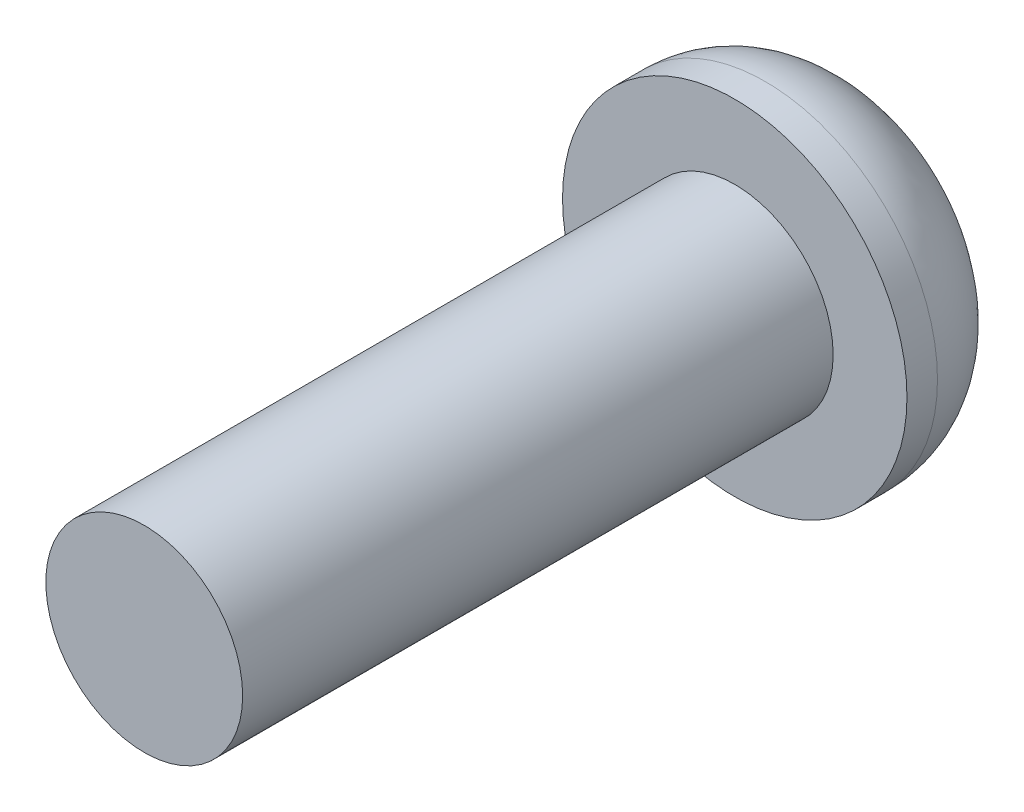
ISO-10303-21;
HEADER;
FILE_DESCRIPTION(('STEP AP214'),'2;1');
FILE_NAME('part.step','',(''),(''),'','','');
FILE_SCHEMA(('AUTOMOTIVE_DESIGN { 1 0 10303 214 1 1 1 1 }'));
ENDSEC;
DATA;
#1=APPLICATION_CONTEXT('core data for automotive mechanical design processes');
#2=APPLICATION_PROTOCOL_DEFINITION('international standard','automotive_design',2000,#1);
#3=PRODUCT_CONTEXT('',#1,'mechanical');
#4=PRODUCT('Part','Part','',(#3));
#5=PRODUCT_RELATED_PRODUCT_CATEGORY('part','',(#4));
#6=PRODUCT_DEFINITION_FORMATION('','',#4);
#7=PRODUCT_DEFINITION_CONTEXT('part definition',#1,'design');
#8=PRODUCT_DEFINITION('design','',#6,#7);
#9=PRODUCT_DEFINITION_SHAPE('','',#8);
#10=(LENGTH_UNIT() NAMED_UNIT(*) SI_UNIT(.MILLI.,.METRE.));
#11=(NAMED_UNIT(*) PLANE_ANGLE_UNIT() SI_UNIT($,.RADIAN.));
#12=(NAMED_UNIT(*) SI_UNIT($,.STERADIAN.) SOLID_ANGLE_UNIT());
#13=UNCERTAINTY_MEASURE_WITH_UNIT(LENGTH_MEASURE(1.E-05),#10,'distance_accuracy_value','');
#14=(GEOMETRIC_REPRESENTATION_CONTEXT(3) GLOBAL_UNCERTAINTY_ASSIGNED_CONTEXT((#13)) GLOBAL_UNIT_ASSIGNED_CONTEXT((#10,
#11,#12)) REPRESENTATION_CONTEXT('',''));
#15=CARTESIAN_POINT('',(0.,0.,0.));
#16=DIRECTION('',(0.,0.,1.));
#17=DIRECTION('',(1.,0.,0.));
#18=AXIS2_PLACEMENT_3D('',#15,#16,#17);
#19=CARTESIAN_POINT('',(0.,0.,6.));
#20=DIRECTION('',(0.,0.,-1.));
#21=DIRECTION('',(-1.,0.,0.));
#22=AXIS2_PLACEMENT_3D('',#19,#20,#21);
#23=CYLINDRICAL_SURFACE('',#22,1.);
#24=CARTESIAN_POINT('',(0.,0.,6.));
#25=DIRECTION('',(0.,0.,1.));
#26=DIRECTION('',(1.,0.,0.));
#27=AXIS2_PLACEMENT_3D('',#24,#25,#26);
#28=CIRCLE('',#27,1.);
#29=CARTESIAN_POINT('',(1.,0.,6.));
#30=VERTEX_POINT('',#29);
#31=EDGE_CURVE('E50',#30,#30,#28,.T.);
#32=ORIENTED_EDGE('',*,*,#31,.F.);
#33=EDGE_LOOP('',(#32));
#34=FACE_BOUND('',#33,.T.);
#35=CARTESIAN_POINT('',(0.,0.,0.));
#36=DIRECTION('',(0.,0.,1.));
#37=DIRECTION('',(1.,0.,0.));
#38=AXIS2_PLACEMENT_3D('',#35,#36,#37);
#39=CIRCLE('',#38,1.);
#40=CARTESIAN_POINT('',(1.,0.,0.));
#41=VERTEX_POINT('',#40);
#42=EDGE_CURVE('E55',#41,#41,#39,.T.);
#43=ORIENTED_EDGE('',*,*,#42,.T.);
#44=EDGE_LOOP('',(#43));
#45=FACE_BOUND('',#44,.T.);
#46=ADVANCED_FACE('F37',(#34,#45),#23,.T.);
#47=CARTESIAN_POINT('',(0.,0.,6.));
#48=DIRECTION('',(0.,0.,1.));
#49=DIRECTION('',(1.,0.,0.));
#50=AXIS2_PLACEMENT_3D('',#47,#48,#49);
#51=PLANE('',#50);
#52=ORIENTED_EDGE('',*,*,#31,.T.);
#53=EDGE_LOOP('',(#52));
#54=FACE_BOUND('',#53,.T.);
#55=ADVANCED_FACE('F82',(#54),#51,.T.);
#56=CARTESIAN_POINT('',(0.,0.,-1.31));
#57=DIRECTION('',(0.,0.,1.));
#58=DIRECTION('',(1.,0.,0.));
#59=AXIS2_PLACEMENT_3D('',#56,#57,#58);
#60=CYLINDRICAL_SURFACE('',#59,1.75);
#61=CARTESIAN_POINT('',(0.,0.,-0.31));
#62=DIRECTION('',(0.,0.,-1.));
#63=DIRECTION('',(-1.,0.,0.));
#64=AXIS2_PLACEMENT_3D('',#61,#62,#63);
#65=CIRCLE('',#64,1.75);
#66=CARTESIAN_POINT('',(-1.75,0.,-0.31));
#67=VERTEX_POINT('',#66);
#68=EDGE_CURVE('E10',#67,#67,#65,.F.);
#69=ORIENTED_EDGE('',*,*,#68,.T.);
#70=EDGE_LOOP('',(#69));
#71=FACE_BOUND('',#70,.T.);
#72=CARTESIAN_POINT('',(0.,0.,0.));
#73=DIRECTION('',(0.,0.,-1.));
#74=DIRECTION('',(-1.,0.,0.));
#75=AXIS2_PLACEMENT_3D('',#72,#73,#74);
#76=CIRCLE('',#75,1.75);
#77=CARTESIAN_POINT('',(-1.75,0.,0.));
#78=VERTEX_POINT('',#77);
#79=EDGE_CURVE('E60',#78,#78,#76,.T.);
#80=ORIENTED_EDGE('',*,*,#79,.T.);
#81=EDGE_LOOP('',(#80));
#82=FACE_BOUND('',#81,.T.);
#83=ADVANCED_FACE('F66',(#71,#82),#60,.T.);
#84=CARTESIAN_POINT('',(0.,0.,-1.31));
#85=DIRECTION('',(0.,0.,-1.));
#86=DIRECTION('',(-1.,0.,0.));
#87=AXIS2_PLACEMENT_3D('',#84,#85,#86);
#88=PLANE('',#87);
#89=CARTESIAN_POINT('',(0.,0.,-1.31));
#90=DIRECTION('',(0.,0.,-1.));
#91=DIRECTION('',(-1.,0.,0.));
#92=AXIS2_PLACEMENT_3D('',#89,#90,#91);
#93=CIRCLE('',#92,0.75);
#94=CARTESIAN_POINT('',(-0.75,0.,-1.31));
#95=VERTEX_POINT('',#94);
#96=EDGE_CURVE('E45',#95,#95,#93,.T.);
#97=ORIENTED_EDGE('',*,*,#96,.T.);
#98=EDGE_LOOP('',(#97));
#99=FACE_BOUND('',#98,.T.);
#100=ADVANCED_FACE('F70',(#99),#88,.T.);
#101=CARTESIAN_POINT('',(0.,0.,0.));
#102=DIRECTION('',(0.,0.,-1.));
#103=DIRECTION('',(-1.,0.,0.));
#104=AXIS2_PLACEMENT_3D('',#101,#102,#103);
#105=PLANE('',#104);
#106=ORIENTED_EDGE('',*,*,#42,.F.);
#107=EDGE_LOOP('',(#106));
#108=FACE_BOUND('',#107,.T.);
#109=ORIENTED_EDGE('',*,*,#79,.F.);
#110=EDGE_LOOP('',(#109));
#111=FACE_BOUND('',#110,.T.);
#112=ADVANCED_FACE('F68',(#108,#111),#105,.F.);
#113=CARTESIAN_POINT('',(0.,0.,-0.31));
#114=DIRECTION('',(0.,0.,-1.));
#115=DIRECTION('',(-1.,0.,0.));
#116=AXIS2_PLACEMENT_3D('',#113,#114,#115);
#117=DEGENERATE_TOROIDAL_SURFACE('',#116,0.75,1.,.T.);
#118=ORIENTED_EDGE('',*,*,#68,.F.);
#119=EDGE_LOOP('',(#118));
#120=FACE_BOUND('',#119,.T.);
#121=ORIENTED_EDGE('',*,*,#96,.F.);
#122=EDGE_LOOP('',(#121));
#123=FACE_BOUND('',#122,.T.);
#124=ADVANCED_FACE('F39',(#120,#123),#117,.T.);
#125=CLOSED_SHELL('',(#46,#55,#83,#100,#112,#124));
#126=MANIFOLD_SOLID_BREP('B2',#125);
#127=ADVANCED_BREP_SHAPE_REPRESENTATION('',(#18,#126),#14);
#128=SHAPE_DEFINITION_REPRESENTATION(#9,#127);
ENDSEC;
END-ISO-10303-21;
